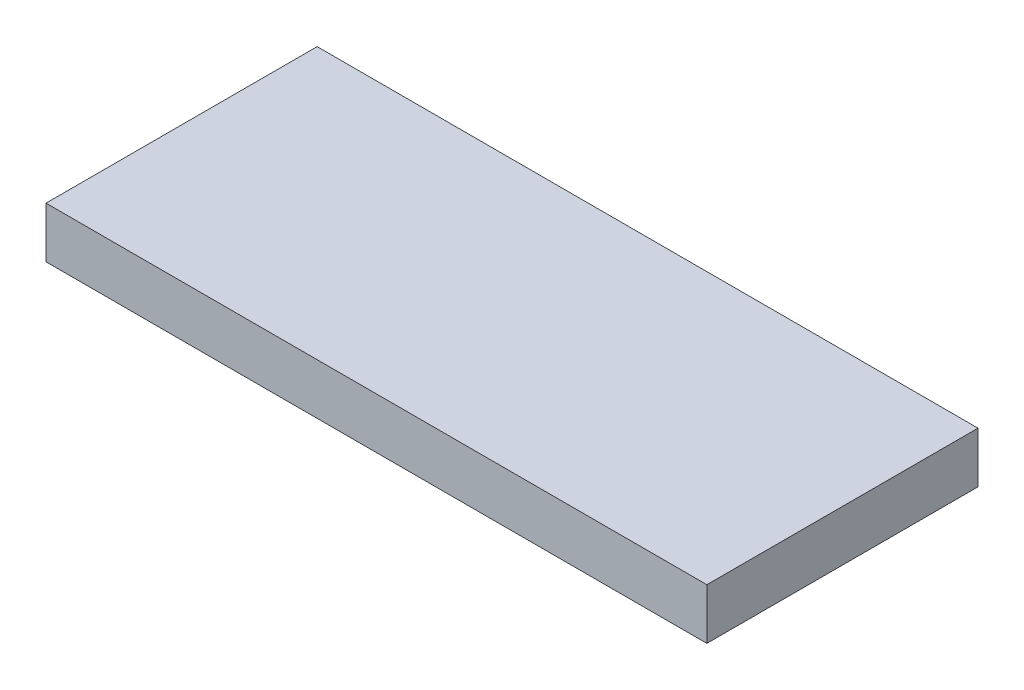
ISO-10303-21;
HEADER;
FILE_DESCRIPTION(('STEP AP214'),'2;1');
FILE_NAME('part.step','',(''),(''),'','','');
FILE_SCHEMA(('AUTOMOTIVE_DESIGN { 1 0 10303 214 1 1 1 1 }'));
ENDSEC;
DATA;
#1=APPLICATION_CONTEXT('core data for automotive mechanical design processes');
#2=APPLICATION_PROTOCOL_DEFINITION('international standard','automotive_design',2000,#1);
#3=PRODUCT_CONTEXT('',#1,'mechanical');
#4=PRODUCT('Part','Part','',(#3));
#5=PRODUCT_RELATED_PRODUCT_CATEGORY('part','',(#4));
#6=PRODUCT_DEFINITION_FORMATION('','',#4);
#7=PRODUCT_DEFINITION_CONTEXT('part definition',#1,'design');
#8=PRODUCT_DEFINITION('design','',#6,#7);
#9=PRODUCT_DEFINITION_SHAPE('','',#8);
#10=(LENGTH_UNIT() NAMED_UNIT(*) SI_UNIT(.MILLI.,.METRE.));
#11=(NAMED_UNIT(*) PLANE_ANGLE_UNIT() SI_UNIT($,.RADIAN.));
#12=(NAMED_UNIT(*) SI_UNIT($,.STERADIAN.) SOLID_ANGLE_UNIT());
#13=UNCERTAINTY_MEASURE_WITH_UNIT(LENGTH_MEASURE(1.E-05),#10,'distance_accuracy_value','');
#14=(GEOMETRIC_REPRESENTATION_CONTEXT(3) GLOBAL_UNCERTAINTY_ASSIGNED_CONTEXT((#13)) GLOBAL_UNIT_ASSIGNED_CONTEXT((#10,
#11,#12)) REPRESENTATION_CONTEXT('',''));
#15=CARTESIAN_POINT('',(0.,0.,0.));
#16=DIRECTION('',(0.,0.,1.));
#17=DIRECTION('',(1.,0.,0.));
#18=AXIS2_PLACEMENT_3D('',#15,#16,#17);
#19=CARTESIAN_POINT('',(247.65,38.1,101.6));
#20=DIRECTION('',(-1.,0.,0.));
#21=DIRECTION('',(0.,0.,1.));
#22=AXIS2_PLACEMENT_3D('',#19,#20,#21);
#23=PLANE('',#22);
#24=DIRECTION('',(0.,0.,-1.));
#25=VECTOR('',#24,1.);
#26=CARTESIAN_POINT('',(247.65,0.,101.6));
#27=LINE('',#26,#25);
#28=CARTESIAN_POINT('',(247.65,0.,101.6));
#29=VERTEX_POINT('',#28);
#30=CARTESIAN_POINT('',(247.65,0.,-101.6));
#31=VERTEX_POINT('',#30);
#32=EDGE_CURVE('E107',#29,#31,#27,.T.);
#33=ORIENTED_EDGE('',*,*,#32,.T.);
#34=DIRECTION('',(0.,-1.,0.));
#35=VECTOR('',#34,1.);
#36=CARTESIAN_POINT('',(247.65,38.1,-101.6));
#37=LINE('',#36,#35);
#38=CARTESIAN_POINT('',(247.65,38.1,-101.6));
#39=VERTEX_POINT('',#38);
#40=EDGE_CURVE('E11',#39,#31,#37,.T.);
#41=ORIENTED_EDGE('',*,*,#40,.F.);
#42=DIRECTION('',(0.,0.,-1.));
#43=VECTOR('',#42,1.);
#44=CARTESIAN_POINT('',(247.65,38.1,101.6));
#45=LINE('',#44,#43);
#46=CARTESIAN_POINT('',(247.65,38.1,101.6));
#47=VERTEX_POINT('',#46);
#48=EDGE_CURVE('E91',#47,#39,#45,.T.);
#49=ORIENTED_EDGE('',*,*,#48,.F.);
#50=DIRECTION('',(0.,-1.,0.));
#51=VECTOR('',#50,1.);
#52=CARTESIAN_POINT('',(247.65,38.1,101.6));
#53=LINE('',#52,#51);
#54=EDGE_CURVE('E103',#47,#29,#53,.T.);
#55=ORIENTED_EDGE('',*,*,#54,.T.);
#56=EDGE_LOOP('',(#33,#41,#49,#55));
#57=FACE_BOUND('',#56,.T.);
#58=ADVANCED_FACE('F39',(#57),#23,.F.);
#59=CARTESIAN_POINT('',(-247.65,38.1,-101.6));
#60=DIRECTION('',(0.,0.,1.));
#61=DIRECTION('',(1.,0.,0.));
#62=AXIS2_PLACEMENT_3D('',#59,#60,#61);
#63=PLANE('',#62);
#64=DIRECTION('',(-1.,0.,0.));
#65=VECTOR('',#64,1.);
#66=CARTESIAN_POINT('',(-247.65,0.,-101.6));
#67=LINE('',#66,#65);
#68=CARTESIAN_POINT('',(-247.65,0.,-101.6));
#69=VERTEX_POINT('',#68);
#70=EDGE_CURVE('E96',#31,#69,#67,.T.);
#71=ORIENTED_EDGE('',*,*,#70,.T.);
#72=DIRECTION('',(0.,-1.,0.));
#73=VECTOR('',#72,1.);
#74=CARTESIAN_POINT('',(-247.65,38.1,-101.6));
#75=LINE('',#74,#73);
#76=CARTESIAN_POINT('',(-247.65,38.1,-101.6));
#77=VERTEX_POINT('',#76);
#78=EDGE_CURVE('E48',#77,#69,#75,.T.);
#79=ORIENTED_EDGE('',*,*,#78,.F.);
#80=DIRECTION('',(-1.,0.,0.));
#81=VECTOR('',#80,1.);
#82=CARTESIAN_POINT('',(-247.65,38.1,-101.6));
#83=LINE('',#82,#81);
#84=EDGE_CURVE('E86',#39,#77,#83,.T.);
#85=ORIENTED_EDGE('',*,*,#84,.F.);
#86=ORIENTED_EDGE('',*,*,#40,.T.);
#87=EDGE_LOOP('',(#71,#79,#85,#86));
#88=FACE_BOUND('',#87,.T.);
#89=ADVANCED_FACE('F95',(#88),#63,.F.);
#90=CARTESIAN_POINT('',(-247.65,38.1,101.6));
#91=DIRECTION('',(1.,0.,0.));
#92=DIRECTION('',(0.,0.,-1.));
#93=AXIS2_PLACEMENT_3D('',#90,#91,#92);
#94=PLANE('',#93);
#95=DIRECTION('',(0.,0.,1.));
#96=VECTOR('',#95,1.);
#97=CARTESIAN_POINT('',(-247.65,0.,101.6));
#98=LINE('',#97,#96);
#99=CARTESIAN_POINT('',(-247.65,0.,101.6));
#100=VERTEX_POINT('',#99);
#101=EDGE_CURVE('E73',#69,#100,#98,.T.);
#102=ORIENTED_EDGE('',*,*,#101,.T.);
#103=DIRECTION('',(0.,-1.,0.));
#104=VECTOR('',#103,1.);
#105=CARTESIAN_POINT('',(-247.65,38.1,101.6));
#106=LINE('',#105,#104);
#107=CARTESIAN_POINT('',(-247.65,38.1,101.6));
#108=VERTEX_POINT('',#107);
#109=EDGE_CURVE('E98',#108,#100,#106,.T.);
#110=ORIENTED_EDGE('',*,*,#109,.F.);
#111=DIRECTION('',(0.,0.,1.));
#112=VECTOR('',#111,1.);
#113=CARTESIAN_POINT('',(-247.65,38.1,101.6));
#114=LINE('',#113,#112);
#115=EDGE_CURVE('E89',#77,#108,#114,.T.);
#116=ORIENTED_EDGE('',*,*,#115,.F.);
#117=ORIENTED_EDGE('',*,*,#78,.T.);
#118=EDGE_LOOP('',(#102,#110,#116,#117));
#119=FACE_BOUND('',#118,.T.);
#120=ADVANCED_FACE('F99',(#119),#94,.F.);
#121=CARTESIAN_POINT('',(-247.65,38.1,101.6));
#122=DIRECTION('',(0.,0.,-1.));
#123=DIRECTION('',(-1.,0.,0.));
#124=AXIS2_PLACEMENT_3D('',#121,#122,#123);
#125=PLANE('',#124);
#126=DIRECTION('',(1.,0.,0.));
#127=VECTOR('',#126,1.);
#128=CARTESIAN_POINT('',(-247.65,0.,101.6));
#129=LINE('',#128,#127);
#130=EDGE_CURVE('E79',#100,#29,#129,.T.);
#131=ORIENTED_EDGE('',*,*,#130,.T.);
#132=ORIENTED_EDGE('',*,*,#54,.F.);
#133=DIRECTION('',(1.,0.,0.));
#134=VECTOR('',#133,1.);
#135=CARTESIAN_POINT('',(-247.65,38.1,101.6));
#136=LINE('',#135,#134);
#137=EDGE_CURVE('E56',#108,#47,#136,.T.);
#138=ORIENTED_EDGE('',*,*,#137,.F.);
#139=ORIENTED_EDGE('',*,*,#109,.T.);
#140=EDGE_LOOP('',(#131,#132,#138,#139));
#141=FACE_BOUND('',#140,.T.);
#142=ADVANCED_FACE('F120',(#141),#125,.F.);
#143=CARTESIAN_POINT('',(0.,38.1,0.));
#144=DIRECTION('',(0.,-1.,0.));
#145=DIRECTION('',(0.,0.,-1.));
#146=AXIS2_PLACEMENT_3D('',#143,#144,#145);
#147=PLANE('',#146);
#148=ORIENTED_EDGE('',*,*,#48,.T.);
#149=ORIENTED_EDGE('',*,*,#84,.T.);
#150=ORIENTED_EDGE('',*,*,#115,.T.);
#151=ORIENTED_EDGE('',*,*,#137,.T.);
#152=EDGE_LOOP('',(#148,#149,#150,#151));
#153=FACE_BOUND('',#152,.T.);
#154=ADVANCED_FACE('F87',(#153),#147,.F.);
#155=CARTESIAN_POINT('',(0.,0.,0.));
#156=DIRECTION('',(0.,-1.,0.));
#157=DIRECTION('',(0.,0.,-1.));
#158=AXIS2_PLACEMENT_3D('',#155,#156,#157);
#159=PLANE('',#158);
#160=ORIENTED_EDGE('',*,*,#32,.F.);
#161=ORIENTED_EDGE('',*,*,#130,.F.);
#162=ORIENTED_EDGE('',*,*,#101,.F.);
#163=ORIENTED_EDGE('',*,*,#70,.F.);
#164=EDGE_LOOP('',(#160,#161,#162,#163));
#165=FACE_BOUND('',#164,.T.);
#166=ADVANCED_FACE('F123',(#165),#159,.T.);
#167=CLOSED_SHELL('',(#58,#89,#120,#142,#154,#166));
#168=MANIFOLD_SOLID_BREP('B2',#167);
#169=ADVANCED_BREP_SHAPE_REPRESENTATION('',(#18,#168),#14);
#170=SHAPE_DEFINITION_REPRESENTATION(#9,#169);
ENDSEC;
END-ISO-10303-21;
